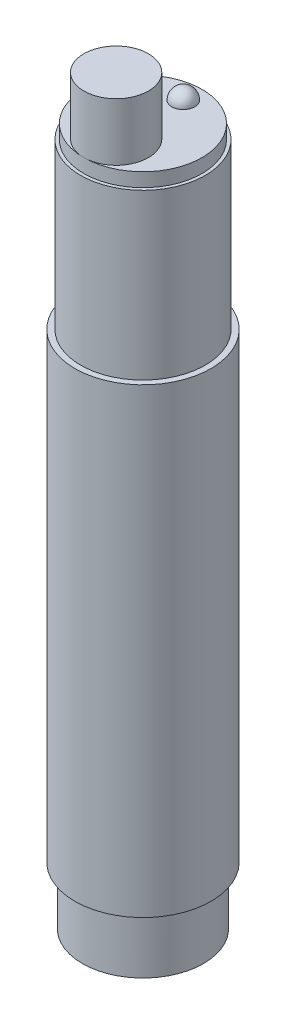
ISO-10303-21;
HEADER;
FILE_DESCRIPTION(('STEP AP214'),'2;1');
FILE_NAME('part.step','',(''),(''),'','','');
FILE_SCHEMA(('AUTOMOTIVE_DESIGN { 1 0 10303 214 1 1 1 1 }'));
ENDSEC;
DATA;
#1=APPLICATION_CONTEXT('core data for automotive mechanical design processes');
#2=APPLICATION_PROTOCOL_DEFINITION('international standard','automotive_design',2000,#1);
#3=PRODUCT_CONTEXT('',#1,'mechanical');
#4=PRODUCT('Part','Part','',(#3));
#5=PRODUCT_RELATED_PRODUCT_CATEGORY('part','',(#4));
#6=PRODUCT_DEFINITION_FORMATION('','',#4);
#7=PRODUCT_DEFINITION_CONTEXT('part definition',#1,'design');
#8=PRODUCT_DEFINITION('design','',#6,#7);
#9=PRODUCT_DEFINITION_SHAPE('','',#8);
#10=(LENGTH_UNIT() NAMED_UNIT(*) SI_UNIT(.MILLI.,.METRE.));
#11=(NAMED_UNIT(*) PLANE_ANGLE_UNIT() SI_UNIT($,.RADIAN.));
#12=(NAMED_UNIT(*) SI_UNIT($,.STERADIAN.) SOLID_ANGLE_UNIT());
#13=UNCERTAINTY_MEASURE_WITH_UNIT(LENGTH_MEASURE(1.E-05),#10,'distance_accuracy_value','');
#14=(GEOMETRIC_REPRESENTATION_CONTEXT(3) GLOBAL_UNCERTAINTY_ASSIGNED_CONTEXT((#13)) GLOBAL_UNIT_ASSIGNED_CONTEXT((#10,
#11,#12)) REPRESENTATION_CONTEXT('',''));
#15=CARTESIAN_POINT('',(0.,0.,0.));
#16=DIRECTION('',(0.,0.,1.));
#17=DIRECTION('',(1.,0.,0.));
#18=AXIS2_PLACEMENT_3D('',#15,#16,#17);
#19=CARTESIAN_POINT('',(0.,55.45,0.));
#20=DIRECTION('',(0.,1.,0.));
#21=DIRECTION('',(0.,0.,1.));
#22=AXIS2_PLACEMENT_3D('',#19,#20,#21);
#23=PLANE('',#22);
#24=CARTESIAN_POINT('',(0.,55.45,0.));
#25=DIRECTION('',(0.,1.,0.));
#26=DIRECTION('',(0.,0.,1.));
#27=AXIS2_PLACEMENT_3D('',#24,#25,#26);
#28=CIRCLE('',#27,5.125);
#29=CARTESIAN_POINT('',(0.,55.45,5.125));
#30=VERTEX_POINT('',#29);
#31=EDGE_CURVE('E48',#30,#30,#28,.T.);
#32=ORIENTED_EDGE('',*,*,#31,.T.);
#33=CARTESIAN_POINT('',(0.,55.45,2.325));
#34=DIRECTION('',(0.,1.,0.));
#35=DIRECTION('',(0.,0.,1.));
#36=AXIS2_PLACEMENT_3D('',#33,#34,#35);
#37=CIRCLE('',#36,2.8);
#38=EDGE_CURVE('E63',#30,#30,#37,.T.);
#39=ORIENTED_EDGE('',*,*,#38,.F.);
#40=EDGE_LOOP('',(#32,#39));
#41=FACE_BOUND('',#40,.T.);
#42=CARTESIAN_POINT('',(0.,55.45,-3.5));
#43=DIRECTION('',(0.,1.,0.));
#44=DIRECTION('',(0.,0.,1.));
#45=AXIS2_PLACEMENT_3D('',#42,#43,#44);
#46=CIRCLE('',#45,1.);
#47=CARTESIAN_POINT('',(0.,55.45,-2.5));
#48=VERTEX_POINT('',#47);
#49=EDGE_CURVE('E40',#48,#48,#46,.F.);
#50=ORIENTED_EDGE('',*,*,#49,.T.);
#51=EDGE_LOOP('',(#50));
#52=FACE_BOUND('',#51,.T.);
#53=ADVANCED_FACE('F36',(#41,#52),#23,.T.);
#54=CARTESIAN_POINT('',(0.,0.,0.));
#55=DIRECTION('',(0.,1.,0.));
#56=DIRECTION('',(0.,0.,1.));
#57=AXIS2_PLACEMENT_3D('',#54,#55,#56);
#58=PLANE('',#57);
#59=CARTESIAN_POINT('',(0.,0.,0.));
#60=DIRECTION('',(0.,1.,0.));
#61=DIRECTION('',(0.,0.,1.));
#62=AXIS2_PLACEMENT_3D('',#59,#60,#61);
#63=CIRCLE('',#62,5.9);
#64=CARTESIAN_POINT('',(0.,0.,5.9));
#65=VERTEX_POINT('',#64);
#66=EDGE_CURVE('E67',#65,#65,#63,.T.);
#67=ORIENTED_EDGE('',*,*,#66,.F.);
#68=EDGE_LOOP('',(#67));
#69=FACE_BOUND('',#68,.T.);
#70=CARTESIAN_POINT('',(0.,0.,0.));
#71=DIRECTION('',(0.,1.,0.));
#72=DIRECTION('',(0.,0.,1.));
#73=AXIS2_PLACEMENT_3D('',#70,#71,#72);
#74=CIRCLE('',#73,5.25);
#75=CARTESIAN_POINT('',(0.,0.,5.25));
#76=VERTEX_POINT('',#75);
#77=EDGE_CURVE('E11',#76,#76,#74,.F.);
#78=ORIENTED_EDGE('',*,*,#77,.F.);
#79=EDGE_LOOP('',(#78));
#80=FACE_BOUND('',#79,.T.);
#81=ADVANCED_FACE('F75',(#69,#80),#58,.F.);
#82=CARTESIAN_POINT('',(0.,54.25,0.));
#83=DIRECTION('',(0.,1.,0.));
#84=DIRECTION('',(0.,0.,1.));
#85=AXIS2_PLACEMENT_3D('',#82,#83,#84);
#86=PLANE('',#85);
#87=CARTESIAN_POINT('',(0.,54.25,0.));
#88=DIRECTION('',(0.,1.,0.));
#89=DIRECTION('',(0.,0.,1.));
#90=AXIS2_PLACEMENT_3D('',#87,#88,#89);
#91=CIRCLE('',#90,5.4);
#92=CARTESIAN_POINT('',(0.,54.25,-5.4));
#93=VERTEX_POINT('',#92);
#94=EDGE_CURVE('E57',#93,#93,#91,.T.);
#95=ORIENTED_EDGE('',*,*,#94,.T.);
#96=EDGE_LOOP('',(#95));
#97=FACE_BOUND('',#96,.T.);
#98=CARTESIAN_POINT('',(0.,54.25,0.));
#99=DIRECTION('',(0.,1.,0.));
#100=DIRECTION('',(0.,0.,1.));
#101=AXIS2_PLACEMENT_3D('',#98,#99,#100);
#102=CIRCLE('',#101,5.125);
#103=CARTESIAN_POINT('',(0.,54.25,5.125));
#104=VERTEX_POINT('',#103);
#105=EDGE_CURVE('E54',#104,#104,#102,.T.);
#106=ORIENTED_EDGE('',*,*,#105,.F.);
#107=EDGE_LOOP('',(#106));
#108=FACE_BOUND('',#107,.T.);
#109=ADVANCED_FACE('F78',(#97,#108),#86,.T.);
#110=CARTESIAN_POINT('',(0.,40.,0.));
#111=DIRECTION('',(0.,1.,0.));
#112=DIRECTION('',(0.,0.,1.));
#113=AXIS2_PLACEMENT_3D('',#110,#111,#112);
#114=PLANE('',#113);
#115=CARTESIAN_POINT('',(0.,40.,0.));
#116=DIRECTION('',(0.,1.,0.));
#117=DIRECTION('',(0.,0.,1.));
#118=AXIS2_PLACEMENT_3D('',#115,#116,#117);
#119=CIRCLE('',#118,5.9);
#120=CARTESIAN_POINT('',(0.,40.,5.9));
#121=VERTEX_POINT('',#120);
#122=EDGE_CURVE('E44',#121,#121,#119,.T.);
#123=ORIENTED_EDGE('',*,*,#122,.T.);
#124=EDGE_LOOP('',(#123));
#125=FACE_BOUND('',#124,.T.);
#126=CARTESIAN_POINT('',(0.,40.,0.));
#127=DIRECTION('',(0.,1.,0.));
#128=DIRECTION('',(0.,0.,1.));
#129=AXIS2_PLACEMENT_3D('',#126,#127,#128);
#130=CIRCLE('',#129,5.4);
#131=CARTESIAN_POINT('',(0.,40.,-5.4));
#132=VERTEX_POINT('',#131);
#133=EDGE_CURVE('E53',#132,#132,#130,.T.);
#134=ORIENTED_EDGE('',*,*,#133,.F.);
#135=EDGE_LOOP('',(#134));
#136=FACE_BOUND('',#135,.T.);
#137=ADVANCED_FACE('F110',(#125,#136),#114,.T.);
#138=CARTESIAN_POINT('',(0.,40.,0.));
#139=DIRECTION('',(0.,-1.,0.));
#140=DIRECTION('',(0.,0.,-1.));
#141=AXIS2_PLACEMENT_3D('',#138,#139,#140);
#142=CYLINDRICAL_SURFACE('',#141,5.9);
#143=ORIENTED_EDGE('',*,*,#122,.F.);
#144=EDGE_LOOP('',(#143));
#145=FACE_BOUND('',#144,.T.);
#146=ORIENTED_EDGE('',*,*,#66,.T.);
#147=EDGE_LOOP('',(#146));
#148=FACE_BOUND('',#147,.T.);
#149=ADVANCED_FACE('F38',(#145,#148),#142,.T.);
#150=CARTESIAN_POINT('',(0.,54.25,0.));
#151=DIRECTION('',(0.,-1.,0.));
#152=DIRECTION('',(0.,0.,-1.));
#153=AXIS2_PLACEMENT_3D('',#150,#151,#152);
#154=CYLINDRICAL_SURFACE('',#153,5.4);
#155=CARTESIAN_POINT('',(0.,54.25,-5.4));
#156=CARTESIAN_POINT('',(0.,54.1015625,-5.4));
#157=CARTESIAN_POINT('',(0.,53.953125,-5.4));
#158=CARTESIAN_POINT('',(0.,53.65625,-5.4));
#159=CARTESIAN_POINT('',(0.,53.5078125,-5.4));
#160=CARTESIAN_POINT('',(0.,53.2109375,-5.4));
#161=CARTESIAN_POINT('',(0.,53.0625,-5.4));
#162=CARTESIAN_POINT('',(0.,52.765625,-5.4));
#163=CARTESIAN_POINT('',(0.,52.6171875,-5.4));
#164=CARTESIAN_POINT('',(0.,52.3203125,-5.4));
#165=CARTESIAN_POINT('',(0.,52.171875,-5.4));
#166=CARTESIAN_POINT('',(0.,51.875,-5.4));
#167=CARTESIAN_POINT('',(0.,51.7265625,-5.4));
#168=CARTESIAN_POINT('',(0.,51.4296875,-5.4));
#169=CARTESIAN_POINT('',(0.,51.28125,-5.4));
#170=CARTESIAN_POINT('',(0.,50.984375,-5.4));
#171=CARTESIAN_POINT('',(0.,50.8359375,-5.4));
#172=CARTESIAN_POINT('',(0.,50.5390625,-5.4));
#173=CARTESIAN_POINT('',(0.,50.390625,-5.4));
#174=CARTESIAN_POINT('',(0.,50.09375,-5.4));
#175=CARTESIAN_POINT('',(0.,49.9453125,-5.4));
#176=CARTESIAN_POINT('',(0.,49.6484375,-5.4));
#177=CARTESIAN_POINT('',(0.,49.5,-5.4));
#178=CARTESIAN_POINT('',(0.,49.203125,-5.4));
#179=CARTESIAN_POINT('',(0.,49.0546875,-5.4));
#180=CARTESIAN_POINT('',(0.,48.7578125,-5.4));
#181=CARTESIAN_POINT('',(0.,48.609375,-5.4));
#182=CARTESIAN_POINT('',(0.,48.3125,-5.4));
#183=CARTESIAN_POINT('',(0.,48.1640625,-5.4));
#184=CARTESIAN_POINT('',(0.,47.8671875,-5.4));
#185=CARTESIAN_POINT('',(0.,47.71875,-5.4));
#186=CARTESIAN_POINT('',(0.,47.421875,-5.4));
#187=CARTESIAN_POINT('',(0.,47.2734375,-5.4));
#188=CARTESIAN_POINT('',(0.,46.9765625,-5.4));
#189=CARTESIAN_POINT('',(0.,46.828125,-5.4));
#190=CARTESIAN_POINT('',(0.,46.53125,-5.4));
#191=CARTESIAN_POINT('',(0.,46.3828125,-5.4));
#192=CARTESIAN_POINT('',(0.,46.0859375,-5.4));
#193=CARTESIAN_POINT('',(0.,45.9375,-5.4));
#194=CARTESIAN_POINT('',(0.,45.640625,-5.4));
#195=CARTESIAN_POINT('',(0.,45.4921875,-5.4));
#196=CARTESIAN_POINT('',(0.,45.1953125,-5.4));
#197=CARTESIAN_POINT('',(0.,45.046875,-5.4));
#198=CARTESIAN_POINT('',(0.,44.75,-5.4));
#199=CARTESIAN_POINT('',(0.,44.6015625,-5.4));
#200=CARTESIAN_POINT('',(0.,44.3046875,-5.4));
#201=CARTESIAN_POINT('',(0.,44.15625,-5.4));
#202=CARTESIAN_POINT('',(0.,43.859375,-5.4));
#203=CARTESIAN_POINT('',(0.,43.7109375,-5.4));
#204=CARTESIAN_POINT('',(0.,43.4140625,-5.4));
#205=CARTESIAN_POINT('',(0.,43.265625,-5.4));
#206=CARTESIAN_POINT('',(0.,42.96875,-5.4));
#207=CARTESIAN_POINT('',(0.,42.8203125,-5.4));
#208=CARTESIAN_POINT('',(0.,42.5234375,-5.4));
#209=CARTESIAN_POINT('',(0.,42.375,-5.4));
#210=CARTESIAN_POINT('',(0.,42.078125,-5.4));
#211=CARTESIAN_POINT('',(0.,41.9296875,-5.4));
#212=CARTESIAN_POINT('',(0.,41.6328125,-5.4));
#213=CARTESIAN_POINT('',(0.,41.484375,-5.4));
#214=CARTESIAN_POINT('',(0.,41.1875,-5.4));
#215=CARTESIAN_POINT('',(0.,41.0390625,-5.4));
#216=CARTESIAN_POINT('',(0.,40.7421875,-5.4));
#217=CARTESIAN_POINT('',(0.,40.59375,-5.4));
#218=CARTESIAN_POINT('',(0.,40.296875,-5.4));
#219=CARTESIAN_POINT('',(0.,40.1484375,-5.4));
#220=CARTESIAN_POINT('',(0.,40.,-5.4));
#221=B_SPLINE_CURVE_WITH_KNOTS('',3,(#155,#156,#157,#158,#159,#160,#161,#162,#163,#164,#165,
#166,#167,#168,#169,#170,#171,#172,#173,#174,#175,#176,#177,#178,#179,#180,#181,#182,#183,#184,
#185,#186,#187,#188,#189,#190,#191,#192,#193,#194,#195,#196,#197,#198,#199,#200,#201,#202,#203,
#204,#205,#206,#207,#208,#209,#210,#211,#212,#213,#214,#215,#216,#217,#218,#219,#220),
.UNSPECIFIED.,.F.,.F.,(4,2,2,2,2,2,2,2,2,2,2,2,2,2,2,2,2,2,2,2,2,2,2,2,2,2,2,2,2,2,2,2,4),(0.,
0.445312500000003,0.890625000000006,1.3359375,1.78125000000001,2.2265625,2.671875,3.1171875,
3.5625,4.0078125,4.453125,4.89843750000001,5.34375,5.7890625,6.234375,6.6796875,7.125,7.5703125,
8.015625,8.4609375,8.90625,9.3515625,9.796875,10.2421875,10.6875,11.1328125,11.578125,
12.0234375,12.46875,12.9140625,13.359375,13.8046875,14.25),.UNSPECIFIED.);
#222=EDGE_CURVE('BSEAM107',#93,#132,#221,.T.);
#223=ORIENTED_EDGE('',*,*,#94,.F.);
#224=ORIENTED_EDGE('',*,*,#133,.T.);
#225=ORIENTED_EDGE('',*,*,#222,.T.);
#226=ORIENTED_EDGE('',*,*,#222,.F.);
#227=EDGE_LOOP('',(#223,#225,#224,#226));
#228=FACE_BOUND('',#227,.T.);
#229=ADVANCED_FACE('F107',(#228),#154,.T.);
#230=CARTESIAN_POINT('',(0.,55.45,0.));
#231=DIRECTION('',(0.,-1.,0.));
#232=DIRECTION('',(0.,0.,-1.));
#233=AXIS2_PLACEMENT_3D('',#230,#231,#232);
#234=CYLINDRICAL_SURFACE('',#233,5.125);
#235=ORIENTED_EDGE('',*,*,#31,.F.);
#236=EDGE_LOOP('',(#235));
#237=FACE_BOUND('',#236,.T.);
#238=ORIENTED_EDGE('',*,*,#105,.T.);
#239=EDGE_LOOP('',(#238));
#240=FACE_BOUND('',#239,.T.);
#241=ADVANCED_FACE('F49',(#237,#240),#234,.T.);
#242=CARTESIAN_POINT('',(0.,60.45,2.325));
#243=DIRECTION('',(0.,-1.,0.));
#244=DIRECTION('',(0.,0.,-1.));
#245=AXIS2_PLACEMENT_3D('',#242,#243,#244);
#246=CYLINDRICAL_SURFACE('',#245,2.8);
#247=CARTESIAN_POINT('',(0.,60.45,2.325));
#248=DIRECTION('',(0.,1.,0.));
#249=DIRECTION('',(0.,0.,1.));
#250=AXIS2_PLACEMENT_3D('',#247,#248,#249);
#251=CIRCLE('',#250,2.8);
#252=CARTESIAN_POINT('',(0.,60.45,5.125));
#253=VERTEX_POINT('',#252);
#254=EDGE_CURVE('E60',#253,#253,#251,.T.);
#255=ORIENTED_EDGE('',*,*,#254,.F.);
#256=EDGE_LOOP('',(#255));
#257=FACE_BOUND('',#256,.T.);
#258=ORIENTED_EDGE('',*,*,#38,.T.);
#259=EDGE_LOOP('',(#258));
#260=FACE_BOUND('',#259,.T.);
#261=ADVANCED_FACE('F94',(#257,#260),#246,.T.);
#262=CARTESIAN_POINT('',(0.,60.45,2.325));
#263=DIRECTION('',(0.,1.,0.));
#264=DIRECTION('',(0.,0.,1.));
#265=AXIS2_PLACEMENT_3D('',#262,#263,#264);
#266=PLANE('',#265);
#267=ORIENTED_EDGE('',*,*,#254,.T.);
#268=EDGE_LOOP('',(#267));
#269=FACE_BOUND('',#268,.T.);
#270=ADVANCED_FACE('F84',(#269),#266,.T.);
#271=CARTESIAN_POINT('',(0.,-5.,0.));
#272=DIRECTION('',(0.,1.,0.));
#273=DIRECTION('',(0.,0.,1.));
#274=AXIS2_PLACEMENT_3D('',#271,#272,#273);
#275=CYLINDRICAL_SURFACE('',#274,5.25);
#276=CARTESIAN_POINT('',(0.,-5.,0.));
#277=DIRECTION('',(0.,-1.,0.));
#278=DIRECTION('',(0.,0.,-1.));
#279=AXIS2_PLACEMENT_3D('',#276,#277,#278);
#280=CIRCLE('',#279,5.25);
#281=CARTESIAN_POINT('',(0.,-5.,-5.25));
#282=VERTEX_POINT('',#281);
#283=EDGE_CURVE('E181',#282,#282,#280,.T.);
#284=ORIENTED_EDGE('',*,*,#283,.F.);
#285=EDGE_LOOP('',(#284));
#286=FACE_BOUND('',#285,.T.);
#287=ORIENTED_EDGE('',*,*,#77,.T.);
#288=EDGE_LOOP('',(#287));
#289=FACE_BOUND('',#288,.T.);
#290=ADVANCED_FACE('F81',(#286,#289),#275,.T.);
#291=CARTESIAN_POINT('',(0.,-5.,0.));
#292=DIRECTION('',(0.,-1.,0.));
#293=DIRECTION('',(0.,0.,-1.));
#294=AXIS2_PLACEMENT_3D('',#291,#292,#293);
#295=PLANE('',#294);
#296=ORIENTED_EDGE('',*,*,#283,.T.);
#297=EDGE_LOOP('',(#296));
#298=FACE_BOUND('',#297,.T.);
#299=ADVANCED_FACE('F83',(#298),#295,.T.);
#300=CARTESIAN_POINT('',(0.,55.45,-3.5));
#301=DIRECTION('',(0.,0.,1.));
#302=DIRECTION('',(-1.,0.,0.));
#303=AXIS2_PLACEMENT_3D('',#300,#301,#302);
#304=SPHERICAL_SURFACE('',#303,1.);
#305=CARTESIAN_POINT('',(0.,55.45,-3.5));
#306=DIRECTION('',(0.,1.,0.));
#307=DIRECTION('',(0.,0.,1.));
#308=AXIS2_PLACEMENT_3D('',#305,#306,#307);
#309=SPHERICAL_SURFACE('',#308,1.);
#310=ORIENTED_EDGE('',*,*,#49,.F.);
#311=EDGE_LOOP('',(#310));
#312=FACE_BOUND('',#311,.T.);
#313=ADVANCED_FACE('F91',(#312),#309,.T.);
#314=CLOSED_SHELL('',(#53,#81,#109,#137,#149,#229,#241,#261,#270,#290,#299,#313));
#315=MANIFOLD_SOLID_BREP('B2',#314);
#316=ADVANCED_BREP_SHAPE_REPRESENTATION('',(#18,#315),#14);
#317=SHAPE_DEFINITION_REPRESENTATION(#9,#316);
ENDSEC;
END-ISO-10303-21;
